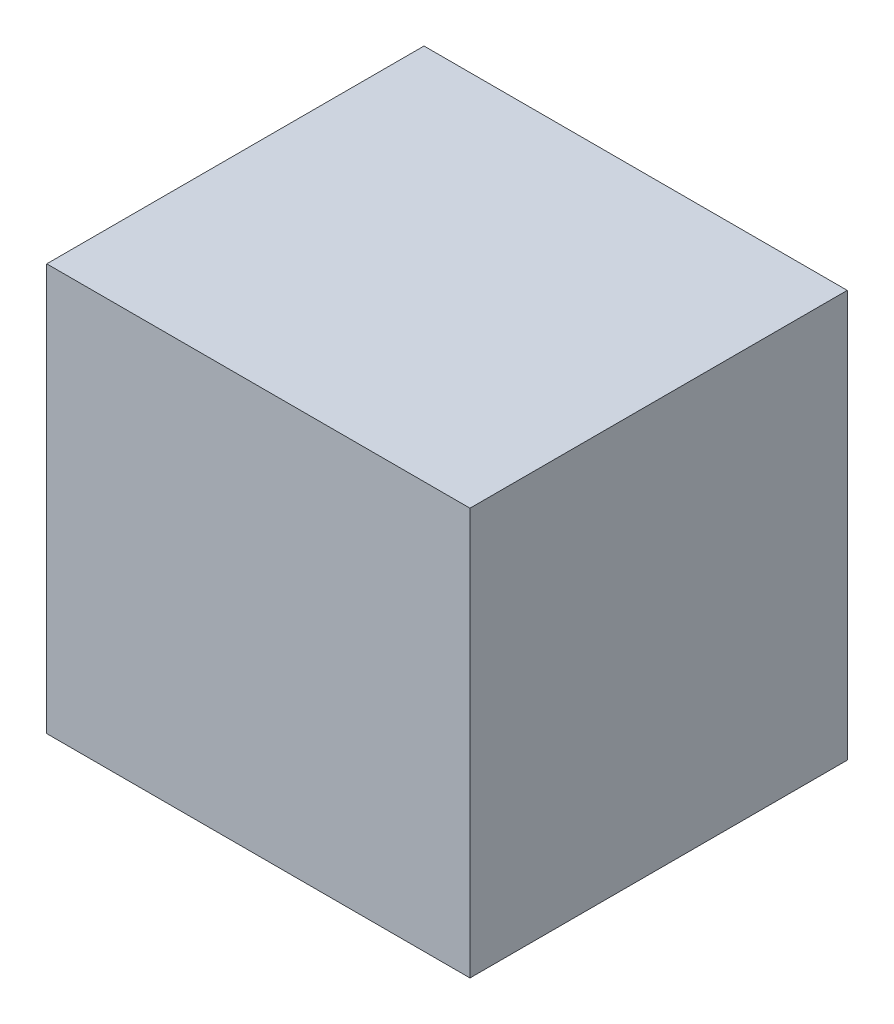
ISO-10303-21;
HEADER;
FILE_DESCRIPTION(('STEP AP214'),'2;1');
FILE_NAME('part.step','',(''),(''),'','','');
FILE_SCHEMA(('AUTOMOTIVE_DESIGN { 1 0 10303 214 1 1 1 1 }'));
ENDSEC;
DATA;
#1=APPLICATION_CONTEXT('core data for automotive mechanical design processes');
#2=APPLICATION_PROTOCOL_DEFINITION('international standard','automotive_design',2000,#1);
#3=PRODUCT_CONTEXT('',#1,'mechanical');
#4=PRODUCT('Part','Part','',(#3));
#5=PRODUCT_RELATED_PRODUCT_CATEGORY('part','',(#4));
#6=PRODUCT_DEFINITION_FORMATION('','',#4);
#7=PRODUCT_DEFINITION_CONTEXT('part definition',#1,'design');
#8=PRODUCT_DEFINITION('design','',#6,#7);
#9=PRODUCT_DEFINITION_SHAPE('','',#8);
#10=(LENGTH_UNIT() NAMED_UNIT(*) SI_UNIT(.MILLI.,.METRE.));
#11=(NAMED_UNIT(*) PLANE_ANGLE_UNIT() SI_UNIT($,.RADIAN.));
#12=(NAMED_UNIT(*) SI_UNIT($,.STERADIAN.) SOLID_ANGLE_UNIT());
#13=UNCERTAINTY_MEASURE_WITH_UNIT(LENGTH_MEASURE(1.E-05),#10,'distance_accuracy_value','');
#14=(GEOMETRIC_REPRESENTATION_CONTEXT(3) GLOBAL_UNCERTAINTY_ASSIGNED_CONTEXT((#13)) GLOBAL_UNIT_ASSIGNED_CONTEXT((#10,
#11,#12)) REPRESENTATION_CONTEXT('',''));
#15=CARTESIAN_POINT('',(0.,0.,0.));
#16=DIRECTION('',(0.,0.,1.));
#17=DIRECTION('',(1.,0.,0.));
#18=AXIS2_PLACEMENT_3D('',#15,#16,#17);
#19=CARTESIAN_POINT('',(60.,48.6331747110809,28.3147324463436));
#20=DIRECTION('',(0.,0.,-1.));
#21=DIRECTION('',(-1.,0.,0.));
#22=AXIS2_PLACEMENT_3D('',#19,#20,#21);
#23=PLANE('',#22);
#24=DIRECTION('',(0.,-1.,0.));
#25=VECTOR('',#24,1.);
#26=CARTESIAN_POINT('',(-30.,48.6331747110809,28.3147324463436));
#27=LINE('',#26,#25);
#28=CARTESIAN_POINT('',(-30.,48.6331747110809,28.3147324463436));
#29=VERTEX_POINT('',#28);
#30=CARTESIAN_POINT('',(-30.,-37.8840633194134,28.3147324463436));
#31=VERTEX_POINT('',#30);
#32=EDGE_CURVE('E99',#29,#31,#27,.T.);
#33=ORIENTED_EDGE('',*,*,#32,.T.);
#34=DIRECTION('',(-1.,0.,0.));
#35=VECTOR('',#34,1.);
#36=CARTESIAN_POINT('',(60.,-37.8840633194134,28.3147324463436));
#37=LINE('',#36,#35);
#38=CARTESIAN_POINT('',(60.,-37.8840633194134,28.3147324463436));
#39=VERTEX_POINT('',#38);
#40=EDGE_CURVE('E11',#39,#31,#37,.T.);
#41=ORIENTED_EDGE('',*,*,#40,.F.);
#42=DIRECTION('',(0.,-1.,0.));
#43=VECTOR('',#42,1.);
#44=CARTESIAN_POINT('',(60.,48.6331747110809,28.3147324463436));
#45=LINE('',#44,#43);
#46=CARTESIAN_POINT('',(60.,48.6331747110809,28.3147324463436));
#47=VERTEX_POINT('',#46);
#48=EDGE_CURVE('E87',#47,#39,#45,.T.);
#49=ORIENTED_EDGE('',*,*,#48,.F.);
#50=DIRECTION('',(-1.,0.,0.));
#51=VECTOR('',#50,1.);
#52=CARTESIAN_POINT('',(60.,48.6331747110809,28.3147324463436));
#53=LINE('',#52,#51);
#54=EDGE_CURVE('E95',#47,#29,#53,.T.);
#55=ORIENTED_EDGE('',*,*,#54,.T.);
#56=EDGE_LOOP('',(#33,#41,#49,#55));
#57=FACE_BOUND('',#56,.T.);
#58=ADVANCED_FACE('F36',(#57),#23,.F.);
#59=CARTESIAN_POINT('',(60.,-37.8840633194134,28.3147324463436));
#60=DIRECTION('',(0.,1.,0.));
#61=DIRECTION('',(0.,0.,1.));
#62=AXIS2_PLACEMENT_3D('',#59,#60,#61);
#63=PLANE('',#62);
#64=DIRECTION('',(0.,0.,-1.));
#65=VECTOR('',#64,1.);
#66=CARTESIAN_POINT('',(-30.,-37.8840633194134,28.3147324463436));
#67=LINE('',#66,#65);
#68=CARTESIAN_POINT('',(-30.,-37.8840633194134,-51.9103428182966));
#69=VERTEX_POINT('',#68);
#70=EDGE_CURVE('E91',#31,#69,#67,.T.);
#71=ORIENTED_EDGE('',*,*,#70,.T.);
#72=DIRECTION('',(-1.,0.,0.));
#73=VECTOR('',#72,1.);
#74=CARTESIAN_POINT('',(60.,-37.8840633194134,-51.9103428182966));
#75=LINE('',#74,#73);
#76=CARTESIAN_POINT('',(60.,-37.8840633194134,-51.9103428182966));
#77=VERTEX_POINT('',#76);
#78=EDGE_CURVE('E44',#77,#69,#75,.T.);
#79=ORIENTED_EDGE('',*,*,#78,.F.);
#80=DIRECTION('',(0.,0.,-1.));
#81=VECTOR('',#80,1.);
#82=CARTESIAN_POINT('',(60.,-37.8840633194134,28.3147324463436));
#83=LINE('',#82,#81);
#84=EDGE_CURVE('E82',#39,#77,#83,.T.);
#85=ORIENTED_EDGE('',*,*,#84,.F.);
#86=ORIENTED_EDGE('',*,*,#40,.T.);
#87=EDGE_LOOP('',(#71,#79,#85,#86));
#88=FACE_BOUND('',#87,.T.);
#89=ADVANCED_FACE('F90',(#88),#63,.F.);
#90=CARTESIAN_POINT('',(60.,48.6331747110809,-51.9103428182966));
#91=DIRECTION('',(0.,0.,1.));
#92=DIRECTION('',(1.,0.,0.));
#93=AXIS2_PLACEMENT_3D('',#90,#91,#92);
#94=PLANE('',#93);
#95=DIRECTION('',(0.,1.,0.));
#96=VECTOR('',#95,1.);
#97=CARTESIAN_POINT('',(-30.,48.6331747110809,-51.9103428182966));
#98=LINE('',#97,#96);
#99=CARTESIAN_POINT('',(-30.,48.6331747110809,-51.9103428182966));
#100=VERTEX_POINT('',#99);
#101=EDGE_CURVE('E69',#69,#100,#98,.T.);
#102=ORIENTED_EDGE('',*,*,#101,.T.);
#103=DIRECTION('',(-1.,0.,0.));
#104=VECTOR('',#103,1.);
#105=CARTESIAN_POINT('',(60.,48.6331747110809,-51.9103428182966));
#106=LINE('',#105,#104);
#107=CARTESIAN_POINT('',(60.,48.6331747110809,-51.9103428182966));
#108=VERTEX_POINT('',#107);
#109=EDGE_CURVE('E92',#108,#100,#106,.T.);
#110=ORIENTED_EDGE('',*,*,#109,.F.);
#111=DIRECTION('',(0.,1.,0.));
#112=VECTOR('',#111,1.);
#113=CARTESIAN_POINT('',(60.,48.6331747110809,-51.9103428182966));
#114=LINE('',#113,#112);
#115=EDGE_CURVE('E85',#77,#108,#114,.T.);
#116=ORIENTED_EDGE('',*,*,#115,.F.);
#117=ORIENTED_EDGE('',*,*,#78,.T.);
#118=EDGE_LOOP('',(#102,#110,#116,#117));
#119=FACE_BOUND('',#118,.T.);
#120=ADVANCED_FACE('F93',(#119),#94,.F.);
#121=CARTESIAN_POINT('',(60.,48.6331747110809,28.3147324463436));
#122=DIRECTION('',(0.,-1.,0.));
#123=DIRECTION('',(0.,0.,-1.));
#124=AXIS2_PLACEMENT_3D('',#121,#122,#123);
#125=PLANE('',#124);
#126=DIRECTION('',(0.,0.,1.));
#127=VECTOR('',#126,1.);
#128=CARTESIAN_POINT('',(-30.,48.6331747110809,28.3147324463436));
#129=LINE('',#128,#127);
#130=EDGE_CURVE('E75',#100,#29,#129,.T.);
#131=ORIENTED_EDGE('',*,*,#130,.T.);
#132=ORIENTED_EDGE('',*,*,#54,.F.);
#133=DIRECTION('',(0.,0.,1.));
#134=VECTOR('',#133,1.);
#135=CARTESIAN_POINT('',(60.,48.6331747110809,28.3147324463436));
#136=LINE('',#135,#134);
#137=EDGE_CURVE('E52',#108,#47,#136,.T.);
#138=ORIENTED_EDGE('',*,*,#137,.F.);
#139=ORIENTED_EDGE('',*,*,#109,.T.);
#140=EDGE_LOOP('',(#131,#132,#138,#139));
#141=FACE_BOUND('',#140,.T.);
#142=ADVANCED_FACE('F106',(#141),#125,.F.);
#143=CARTESIAN_POINT('',(60.,-10.7491113916675,23.595610371953));
#144=DIRECTION('',(1.,0.,0.));
#145=DIRECTION('',(0.,0.,-1.));
#146=AXIS2_PLACEMENT_3D('',#143,#144,#145);
#147=PLANE('',#146);
#148=ORIENTED_EDGE('',*,*,#48,.T.);
#149=ORIENTED_EDGE('',*,*,#84,.T.);
#150=ORIENTED_EDGE('',*,*,#115,.T.);
#151=ORIENTED_EDGE('',*,*,#137,.T.);
#152=EDGE_LOOP('',(#148,#149,#150,#151));
#153=FACE_BOUND('',#152,.T.);
#154=ADVANCED_FACE('F83',(#153),#147,.T.);
#155=CARTESIAN_POINT('',(-30.,-10.7491113916675,23.595610371953));
#156=DIRECTION('',(1.,0.,0.));
#157=DIRECTION('',(0.,0.,-1.));
#158=AXIS2_PLACEMENT_3D('',#155,#156,#157);
#159=PLANE('',#158);
#160=ORIENTED_EDGE('',*,*,#32,.F.);
#161=ORIENTED_EDGE('',*,*,#130,.F.);
#162=ORIENTED_EDGE('',*,*,#101,.F.);
#163=ORIENTED_EDGE('',*,*,#70,.F.);
#164=EDGE_LOOP('',(#160,#161,#162,#163));
#165=FACE_BOUND('',#164,.T.);
#166=ADVANCED_FACE('F109',(#165),#159,.F.);
#167=CLOSED_SHELL('',(#58,#89,#120,#142,#154,#166));
#168=MANIFOLD_SOLID_BREP('B2',#167);
#169=ADVANCED_BREP_SHAPE_REPRESENTATION('',(#18,#168),#14);
#170=SHAPE_DEFINITION_REPRESENTATION(#9,#169);
ENDSEC;
END-ISO-10303-21;
